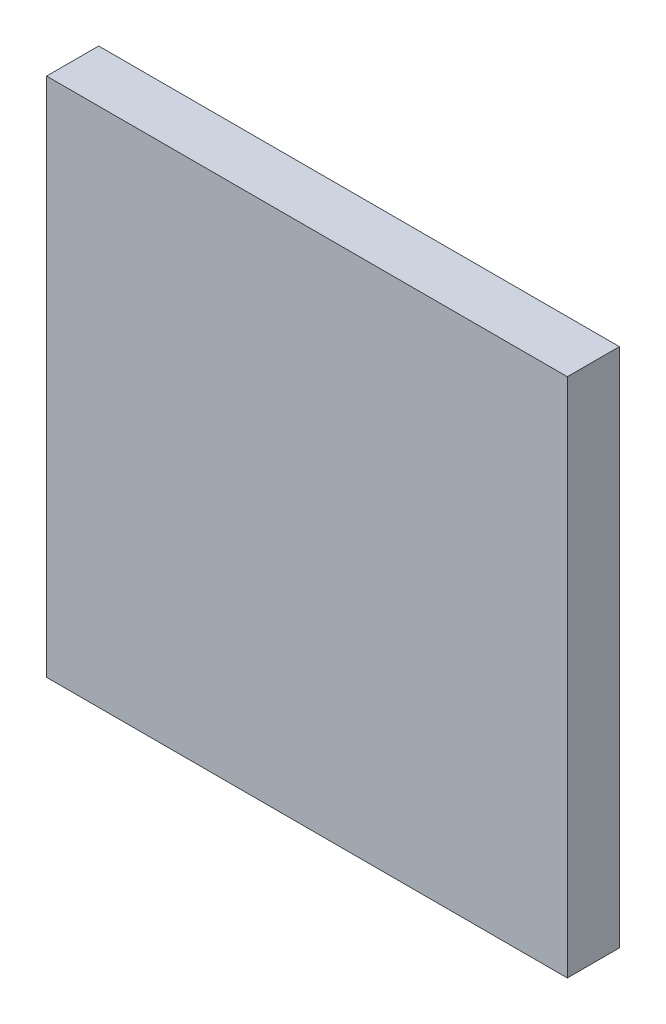
ISO-10303-21;
HEADER;
FILE_DESCRIPTION(('STEP AP214'),'2;1');
FILE_NAME('part.step','',(''),(''),'','','');
FILE_SCHEMA(('AUTOMOTIVE_DESIGN { 1 0 10303 214 1 1 1 1 }'));
ENDSEC;
DATA;
#1=APPLICATION_CONTEXT('core data for automotive mechanical design processes');
#2=APPLICATION_PROTOCOL_DEFINITION('international standard','automotive_design',2000,#1);
#3=PRODUCT_CONTEXT('',#1,'mechanical');
#4=PRODUCT('Part','Part','',(#3));
#5=PRODUCT_RELATED_PRODUCT_CATEGORY('part','',(#4));
#6=PRODUCT_DEFINITION_FORMATION('','',#4);
#7=PRODUCT_DEFINITION_CONTEXT('part definition',#1,'design');
#8=PRODUCT_DEFINITION('design','',#6,#7);
#9=PRODUCT_DEFINITION_SHAPE('','',#8);
#10=(LENGTH_UNIT() NAMED_UNIT(*) SI_UNIT(.MILLI.,.METRE.));
#11=(NAMED_UNIT(*) PLANE_ANGLE_UNIT() SI_UNIT($,.RADIAN.));
#12=(NAMED_UNIT(*) SI_UNIT($,.STERADIAN.) SOLID_ANGLE_UNIT());
#13=UNCERTAINTY_MEASURE_WITH_UNIT(LENGTH_MEASURE(1.E-05),#10,'distance_accuracy_value','');
#14=(GEOMETRIC_REPRESENTATION_CONTEXT(3) GLOBAL_UNCERTAINTY_ASSIGNED_CONTEXT((#13)) GLOBAL_UNIT_ASSIGNED_CONTEXT((#10,
#11,#12)) REPRESENTATION_CONTEXT('',''));
#15=CARTESIAN_POINT('',(0.,0.,0.));
#16=DIRECTION('',(0.,0.,1.));
#17=DIRECTION('',(1.,0.,0.));
#18=AXIS2_PLACEMENT_3D('',#15,#16,#17);
#19=CARTESIAN_POINT('',(0.,0.,0.1));
#20=DIRECTION('',(0.,0.,1.));
#21=DIRECTION('',(1.,0.,0.));
#22=AXIS2_PLACEMENT_3D('',#19,#20,#21);
#23=PLANE('',#22);
#24=DIRECTION('',(1.,0.,0.));
#25=VECTOR('',#24,1.);
#26=CARTESIAN_POINT('',(-0.5,-0.5,0.1));
#27=LINE('',#26,#25);
#28=CARTESIAN_POINT('',(-0.5,-0.5,0.1));
#29=VERTEX_POINT('',#28);
#30=CARTESIAN_POINT('',(0.5,-0.5,0.1));
#31=VERTEX_POINT('',#30);
#32=EDGE_CURVE('E82',#29,#31,#27,.T.);
#33=ORIENTED_EDGE('',*,*,#32,.T.);
#34=DIRECTION('',(0.,1.,0.));
#35=VECTOR('',#34,1.);
#36=CARTESIAN_POINT('',(0.5,-0.5,0.1));
#37=LINE('',#36,#35);
#38=CARTESIAN_POINT('',(0.5,0.5,0.1));
#39=VERTEX_POINT('',#38);
#40=EDGE_CURVE('E68',#31,#39,#37,.T.);
#41=ORIENTED_EDGE('',*,*,#40,.T.);
#42=DIRECTION('',(-1.,0.,0.));
#43=VECTOR('',#42,1.);
#44=CARTESIAN_POINT('',(0.5,0.5,0.1));
#45=LINE('',#44,#43);
#46=CARTESIAN_POINT('',(-0.5,0.5,0.1));
#47=VERTEX_POINT('',#46);
#48=EDGE_CURVE('E20',#39,#47,#45,.T.);
#49=ORIENTED_EDGE('',*,*,#48,.T.);
#50=DIRECTION('',(0.,-1.,0.));
#51=VECTOR('',#50,1.);
#52=CARTESIAN_POINT('',(-0.5,0.5,0.1));
#53=LINE('',#52,#51);
#54=EDGE_CURVE('E11',#47,#29,#53,.T.);
#55=ORIENTED_EDGE('',*,*,#54,.T.);
#56=EDGE_LOOP('',(#33,#41,#49,#55));
#57=FACE_BOUND('',#56,.T.);
#58=ADVANCED_FACE('F16',(#57),#23,.T.);
#59=CARTESIAN_POINT('',(0.,0.,0.));
#60=DIRECTION('',(0.,0.,1.));
#61=DIRECTION('',(1.,0.,0.));
#62=AXIS2_PLACEMENT_3D('',#59,#60,#61);
#63=PLANE('',#62);
#64=DIRECTION('',(1.,0.,0.));
#65=VECTOR('',#64,1.);
#66=CARTESIAN_POINT('',(-0.5,-0.5,0.));
#67=LINE('',#66,#65);
#68=CARTESIAN_POINT('',(-0.5,-0.5,0.));
#69=VERTEX_POINT('',#68);
#70=CARTESIAN_POINT('',(0.5,-0.5,0.));
#71=VERTEX_POINT('',#70);
#72=EDGE_CURVE('E90',#69,#71,#67,.T.);
#73=ORIENTED_EDGE('',*,*,#72,.F.);
#74=DIRECTION('',(0.,-1.,0.));
#75=VECTOR('',#74,1.);
#76=CARTESIAN_POINT('',(-0.5,0.5,0.));
#77=LINE('',#76,#75);
#78=CARTESIAN_POINT('',(-0.5,0.5,0.));
#79=VERTEX_POINT('',#78);
#80=EDGE_CURVE('E27',#79,#69,#77,.T.);
#81=ORIENTED_EDGE('',*,*,#80,.F.);
#82=DIRECTION('',(-1.,0.,0.));
#83=VECTOR('',#82,1.);
#84=CARTESIAN_POINT('',(0.5,0.5,0.));
#85=LINE('',#84,#83);
#86=CARTESIAN_POINT('',(0.5,0.5,0.));
#87=VERTEX_POINT('',#86);
#88=EDGE_CURVE('E79',#87,#79,#85,.T.);
#89=ORIENTED_EDGE('',*,*,#88,.F.);
#90=DIRECTION('',(0.,1.,0.));
#91=VECTOR('',#90,1.);
#92=CARTESIAN_POINT('',(0.5,-0.5,0.));
#93=LINE('',#92,#91);
#94=EDGE_CURVE('E86',#71,#87,#93,.T.);
#95=ORIENTED_EDGE('',*,*,#94,.F.);
#96=EDGE_LOOP('',(#73,#81,#89,#95));
#97=FACE_BOUND('',#96,.T.);
#98=ADVANCED_FACE('F116',(#97),#63,.F.);
#99=CARTESIAN_POINT('',(-0.5,0.5,0.));
#100=DIRECTION('',(1.,0.,0.));
#101=DIRECTION('',(0.,1.,0.));
#102=AXIS2_PLACEMENT_3D('',#99,#100,#101);
#103=PLANE('',#102);
#104=DIRECTION('',(0.,0.,1.));
#105=VECTOR('',#104,1.);
#106=CARTESIAN_POINT('',(-0.5,0.5,0.));
#107=LINE('',#106,#105);
#108=EDGE_CURVE('E110',#79,#47,#107,.T.);
#109=ORIENTED_EDGE('',*,*,#108,.F.);
#110=ORIENTED_EDGE('',*,*,#80,.T.);
#111=DIRECTION('',(0.,0.,1.));
#112=VECTOR('',#111,1.);
#113=CARTESIAN_POINT('',(-0.5,-0.5,0.));
#114=LINE('',#113,#112);
#115=EDGE_CURVE('E95',#69,#29,#114,.T.);
#116=ORIENTED_EDGE('',*,*,#115,.T.);
#117=ORIENTED_EDGE('',*,*,#54,.F.);
#118=EDGE_LOOP('',(#109,#110,#116,#117));
#119=FACE_BOUND('',#118,.T.);
#120=ADVANCED_FACE('F18',(#119),#103,.F.);
#121=CARTESIAN_POINT('',(0.5,0.5,0.));
#122=DIRECTION('',(0.,-1.,0.));
#123=DIRECTION('',(0.,0.,-1.));
#124=AXIS2_PLACEMENT_3D('',#121,#122,#123);
#125=PLANE('',#124);
#126=DIRECTION('',(0.,0.,1.));
#127=VECTOR('',#126,1.);
#128=CARTESIAN_POINT('',(0.5,0.5,0.));
#129=LINE('',#128,#127);
#130=EDGE_CURVE('E76',#87,#39,#129,.T.);
#131=ORIENTED_EDGE('',*,*,#130,.F.);
#132=ORIENTED_EDGE('',*,*,#88,.T.);
#133=ORIENTED_EDGE('',*,*,#108,.T.);
#134=ORIENTED_EDGE('',*,*,#48,.F.);
#135=EDGE_LOOP('',(#131,#132,#133,#134));
#136=FACE_BOUND('',#135,.T.);
#137=ADVANCED_FACE('F118',(#136),#125,.F.);
#138=CARTESIAN_POINT('',(0.5,-0.5,0.));
#139=DIRECTION('',(-1.,0.,0.));
#140=DIRECTION('',(0.,0.,1.));
#141=AXIS2_PLACEMENT_3D('',#138,#139,#140);
#142=PLANE('',#141);
#143=DIRECTION('',(0.,0.,1.));
#144=VECTOR('',#143,1.);
#145=CARTESIAN_POINT('',(0.5,-0.5,0.));
#146=LINE('',#145,#144);
#147=EDGE_CURVE('E73',#71,#31,#146,.T.);
#148=ORIENTED_EDGE('',*,*,#147,.F.);
#149=ORIENTED_EDGE('',*,*,#94,.T.);
#150=ORIENTED_EDGE('',*,*,#130,.T.);
#151=ORIENTED_EDGE('',*,*,#40,.F.);
#152=EDGE_LOOP('',(#148,#149,#150,#151));
#153=FACE_BOUND('',#152,.T.);
#154=ADVANCED_FACE('F70',(#153),#142,.F.);
#155=CARTESIAN_POINT('',(-0.5,-0.5,0.));
#156=DIRECTION('',(0.,1.,0.));
#157=DIRECTION('',(1.,0.,0.));
#158=AXIS2_PLACEMENT_3D('',#155,#156,#157);
#159=PLANE('',#158);
#160=ORIENTED_EDGE('',*,*,#115,.F.);
#161=ORIENTED_EDGE('',*,*,#72,.T.);
#162=ORIENTED_EDGE('',*,*,#147,.T.);
#163=ORIENTED_EDGE('',*,*,#32,.F.);
#164=EDGE_LOOP('',(#160,#161,#162,#163));
#165=FACE_BOUND('',#164,.T.);
#166=ADVANCED_FACE('F88',(#165),#159,.F.);
#167=CLOSED_SHELL('',(#58,#98,#120,#137,#154,#166));
#168=MANIFOLD_SOLID_BREP('B1',#167);
#169=ADVANCED_BREP_SHAPE_REPRESENTATION('',(#18,#168),#14);
#170=SHAPE_DEFINITION_REPRESENTATION(#9,#169);
ENDSEC;
END-ISO-10303-21;
